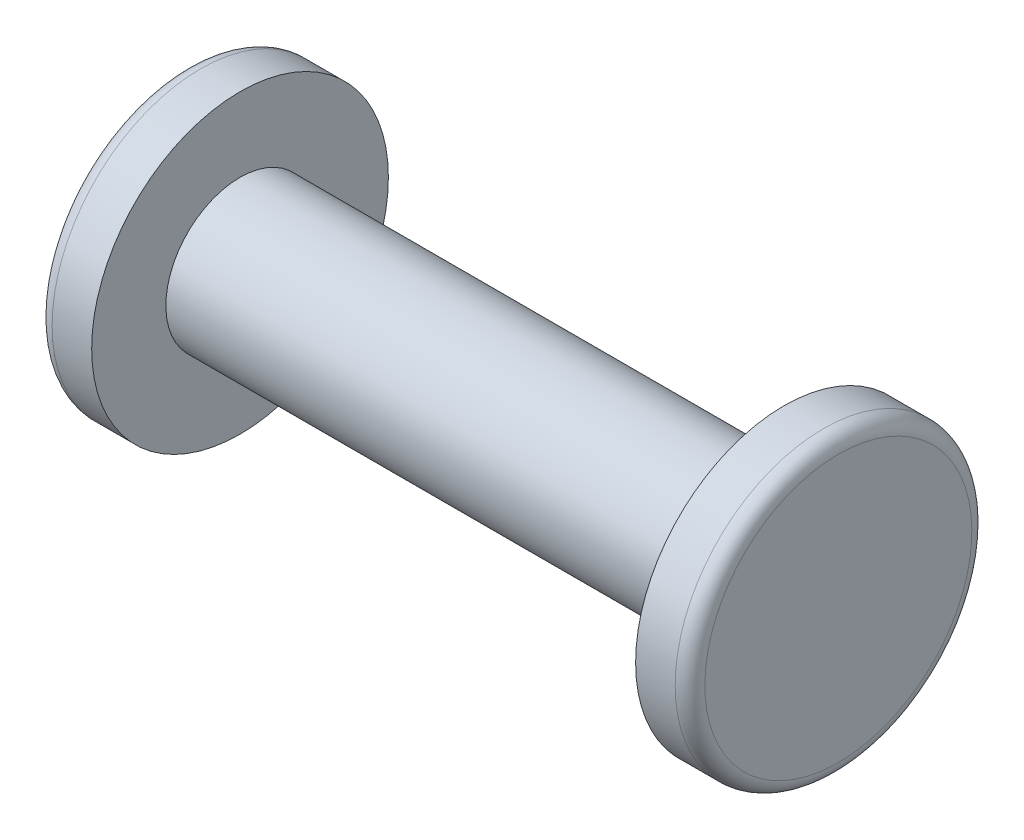
ISO-10303-21;
HEADER;
FILE_DESCRIPTION(('STEP AP214'),'2;1');
FILE_NAME('part.step','',(''),(''),'','','');
FILE_SCHEMA(('AUTOMOTIVE_DESIGN { 1 0 10303 214 1 1 1 1 }'));
ENDSEC;
DATA;
#1=APPLICATION_CONTEXT('core data for automotive mechanical design processes');
#2=APPLICATION_PROTOCOL_DEFINITION('international standard','automotive_design',2000,#1);
#3=PRODUCT_CONTEXT('',#1,'mechanical');
#4=PRODUCT('Part','Part','',(#3));
#5=PRODUCT_RELATED_PRODUCT_CATEGORY('part','',(#4));
#6=PRODUCT_DEFINITION_FORMATION('','',#4);
#7=PRODUCT_DEFINITION_CONTEXT('part definition',#1,'design');
#8=PRODUCT_DEFINITION('design','',#6,#7);
#9=PRODUCT_DEFINITION_SHAPE('','',#8);
#10=(LENGTH_UNIT() NAMED_UNIT(*) SI_UNIT(.MILLI.,.METRE.));
#11=(NAMED_UNIT(*) PLANE_ANGLE_UNIT() SI_UNIT($,.RADIAN.));
#12=(NAMED_UNIT(*) SI_UNIT($,.STERADIAN.) SOLID_ANGLE_UNIT());
#13=UNCERTAINTY_MEASURE_WITH_UNIT(LENGTH_MEASURE(1.E-05),#10,'distance_accuracy_value','');
#14=(GEOMETRIC_REPRESENTATION_CONTEXT(3) GLOBAL_UNCERTAINTY_ASSIGNED_CONTEXT((#13)) GLOBAL_UNIT_ASSIGNED_CONTEXT((#10,
#11,#12)) REPRESENTATION_CONTEXT('',''));
#15=CARTESIAN_POINT('',(0.,0.,0.));
#16=DIRECTION('',(0.,0.,1.));
#17=DIRECTION('',(1.,0.,0.));
#18=AXIS2_PLACEMENT_3D('',#15,#16,#17);
#19=CARTESIAN_POINT('',(0.,0.,0.));
#20=DIRECTION('',(-1.,0.,0.));
#21=DIRECTION('',(0.,-1.,0.));
#22=AXIS2_PLACEMENT_3D('',#19,#20,#21);
#23=PLANE('',#22);
#24=CARTESIAN_POINT('',(0.,0.,0.));
#25=DIRECTION('',(1.,0.,0.));
#26=DIRECTION('',(0.,1.,0.));
#27=AXIS2_PLACEMENT_3D('',#24,#25,#26);
#28=CIRCLE('',#27,2.7);
#29=CARTESIAN_POINT('',(0.,2.7,0.));
#30=VERTEX_POINT('',#29);
#31=EDGE_CURVE('E10',#30,#30,#28,.T.);
#32=ORIENTED_EDGE('',*,*,#31,.F.);
#33=EDGE_LOOP('',(#32));
#34=FACE_BOUND('',#33,.T.);
#35=ADVANCED_FACE('F40',(#34),#23,.T.);
#36=CARTESIAN_POINT('',(0.3,0.,0.));
#37=DIRECTION('',(1.,0.,0.));
#38=DIRECTION('',(0.,1.,0.));
#39=AXIS2_PLACEMENT_3D('',#36,#37,#38);
#40=TOROIDAL_SURFACE('',#39,2.7,0.3);
#41=ORIENTED_EDGE('',*,*,#31,.T.);
#42=EDGE_LOOP('',(#41));
#43=FACE_BOUND('',#42,.T.);
#44=CARTESIAN_POINT('',(0.300000000000002,0.,0.));
#45=DIRECTION('',(1.,0.,0.));
#46=DIRECTION('',(0.,1.,0.));
#47=AXIS2_PLACEMENT_3D('',#44,#45,#46);
#48=CIRCLE('',#47,3.);
#49=CARTESIAN_POINT('',(0.300000000000002,3.,0.));
#50=VERTEX_POINT('',#49);
#51=EDGE_CURVE('E46',#50,#50,#48,.T.);
#52=ORIENTED_EDGE('',*,*,#51,.F.);
#53=EDGE_LOOP('',(#52));
#54=FACE_BOUND('',#53,.T.);
#55=ADVANCED_FACE('F88',(#43,#54),#40,.T.);
#56=CARTESIAN_POINT('',(13.2,0.,0.));
#57=DIRECTION('',(1.,0.,0.));
#58=DIRECTION('',(0.,1.,0.));
#59=AXIS2_PLACEMENT_3D('',#56,#57,#58);
#60=CYLINDRICAL_SURFACE('',#59,3.);
#61=ORIENTED_EDGE('',*,*,#51,.T.);
#62=EDGE_LOOP('',(#61));
#63=FACE_BOUND('',#62,.T.);
#64=CARTESIAN_POINT('',(1.1,0.,0.));
#65=DIRECTION('',(1.,0.,0.));
#66=DIRECTION('',(0.,1.,0.));
#67=AXIS2_PLACEMENT_3D('',#64,#65,#66);
#68=CIRCLE('',#67,3.);
#69=CARTESIAN_POINT('',(1.1,3.,0.));
#70=VERTEX_POINT('',#69);
#71=EDGE_CURVE('E50',#70,#70,#68,.T.);
#72=ORIENTED_EDGE('',*,*,#71,.F.);
#73=EDGE_LOOP('',(#72));
#74=FACE_BOUND('',#73,.T.);
#75=ADVANCED_FACE('F93',(#63,#74),#60,.T.);
#76=CARTESIAN_POINT('',(1.1,3.,0.));
#77=DIRECTION('',(1.,0.,0.));
#78=DIRECTION('',(0.,1.,0.));
#79=AXIS2_PLACEMENT_3D('',#76,#77,#78);
#80=PLANE('',#79);
#81=ORIENTED_EDGE('',*,*,#71,.T.);
#82=EDGE_LOOP('',(#81));
#83=FACE_BOUND('',#82,.T.);
#84=CARTESIAN_POINT('',(1.1,0.,0.));
#85=DIRECTION('',(1.,0.,0.));
#86=DIRECTION('',(0.,1.,0.));
#87=AXIS2_PLACEMENT_3D('',#84,#85,#86);
#88=CIRCLE('',#87,1.5);
#89=CARTESIAN_POINT('',(1.1,1.5,0.));
#90=VERTEX_POINT('',#89);
#91=EDGE_CURVE('E54',#90,#90,#88,.T.);
#92=ORIENTED_EDGE('',*,*,#91,.F.);
#93=EDGE_LOOP('',(#92));
#94=FACE_BOUND('',#93,.T.);
#95=ADVANCED_FACE('F97',(#83,#94),#80,.T.);
#96=CARTESIAN_POINT('',(13.2,0.,0.));
#97=DIRECTION('',(1.,0.,0.));
#98=DIRECTION('',(0.,1.,0.));
#99=AXIS2_PLACEMENT_3D('',#96,#97,#98);
#100=CYLINDRICAL_SURFACE('',#99,1.5);
#101=ORIENTED_EDGE('',*,*,#91,.T.);
#102=EDGE_LOOP('',(#101));
#103=FACE_BOUND('',#102,.T.);
#104=CARTESIAN_POINT('',(12.1,0.,0.));
#105=DIRECTION('',(1.,0.,0.));
#106=DIRECTION('',(0.,1.,0.));
#107=AXIS2_PLACEMENT_3D('',#104,#105,#106);
#108=CIRCLE('',#107,1.5);
#109=CARTESIAN_POINT('',(12.1,1.5,0.));
#110=VERTEX_POINT('',#109);
#111=EDGE_CURVE('E59',#110,#110,#108,.T.);
#112=ORIENTED_EDGE('',*,*,#111,.F.);
#113=EDGE_LOOP('',(#112));
#114=FACE_BOUND('',#113,.T.);
#115=ADVANCED_FACE('F103',(#103,#114),#100,.T.);
#116=CARTESIAN_POINT('',(12.1,1.5,0.));
#117=DIRECTION('',(-1.,0.,0.));
#118=DIRECTION('',(0.,-1.,0.));
#119=AXIS2_PLACEMENT_3D('',#116,#117,#118);
#120=PLANE('',#119);
#121=ORIENTED_EDGE('',*,*,#111,.T.);
#122=EDGE_LOOP('',(#121));
#123=FACE_BOUND('',#122,.T.);
#124=CARTESIAN_POINT('',(12.1,0.,0.));
#125=DIRECTION('',(1.,0.,0.));
#126=DIRECTION('',(0.,1.,0.));
#127=AXIS2_PLACEMENT_3D('',#124,#125,#126);
#128=CIRCLE('',#127,3.);
#129=CARTESIAN_POINT('',(12.1,3.,0.));
#130=VERTEX_POINT('',#129);
#131=EDGE_CURVE('E62',#130,#130,#128,.T.);
#132=ORIENTED_EDGE('',*,*,#131,.F.);
#133=EDGE_LOOP('',(#132));
#134=FACE_BOUND('',#133,.T.);
#135=ADVANCED_FACE('F84',(#123,#134),#120,.T.);
#136=CARTESIAN_POINT('',(13.2,0.,0.));
#137=DIRECTION('',(1.,0.,0.));
#138=DIRECTION('',(0.,1.,0.));
#139=AXIS2_PLACEMENT_3D('',#136,#137,#138);
#140=CYLINDRICAL_SURFACE('',#139,3.);
#141=ORIENTED_EDGE('',*,*,#131,.T.);
#142=EDGE_LOOP('',(#141));
#143=FACE_BOUND('',#142,.T.);
#144=CARTESIAN_POINT('',(12.9,0.,0.));
#145=DIRECTION('',(1.,0.,0.));
#146=DIRECTION('',(0.,1.,0.));
#147=AXIS2_PLACEMENT_3D('',#144,#145,#146);
#148=CIRCLE('',#147,3.);
#149=CARTESIAN_POINT('',(12.9,3.,0.));
#150=VERTEX_POINT('',#149);
#151=EDGE_CURVE('E65',#150,#150,#148,.T.);
#152=ORIENTED_EDGE('',*,*,#151,.F.);
#153=EDGE_LOOP('',(#152));
#154=FACE_BOUND('',#153,.T.);
#155=ADVANCED_FACE('F76',(#143,#154),#140,.T.);
#156=CARTESIAN_POINT('',(12.9,0.,0.));
#157=DIRECTION('',(1.,0.,0.));
#158=DIRECTION('',(0.,1.,0.));
#159=AXIS2_PLACEMENT_3D('',#156,#157,#158);
#160=TOROIDAL_SURFACE('',#159,2.7,0.3);
#161=ORIENTED_EDGE('',*,*,#151,.T.);
#162=EDGE_LOOP('',(#161));
#163=FACE_BOUND('',#162,.T.);
#164=CARTESIAN_POINT('',(13.2,0.,0.));
#165=DIRECTION('',(1.,0.,0.));
#166=DIRECTION('',(0.,1.,0.));
#167=AXIS2_PLACEMENT_3D('',#164,#165,#166);
#168=CIRCLE('',#167,2.7);
#169=CARTESIAN_POINT('',(13.2,2.7,0.));
#170=VERTEX_POINT('',#169);
#171=EDGE_CURVE('E68',#170,#170,#168,.T.);
#172=ORIENTED_EDGE('',*,*,#171,.F.);
#173=EDGE_LOOP('',(#172));
#174=FACE_BOUND('',#173,.T.);
#175=ADVANCED_FACE('F74',(#163,#174),#160,.T.);
#176=CARTESIAN_POINT('',(13.2,2.7,0.));
#177=DIRECTION('',(1.,0.,0.));
#178=DIRECTION('',(0.,1.,0.));
#179=AXIS2_PLACEMENT_3D('',#176,#177,#178);
#180=PLANE('',#179);
#181=ORIENTED_EDGE('',*,*,#171,.T.);
#182=EDGE_LOOP('',(#181));
#183=FACE_BOUND('',#182,.T.);
#184=ADVANCED_FACE('F72',(#183),#180,.T.);
#185=CLOSED_SHELL('',(#35,#55,#75,#95,#115,#135,#155,#175,#184));
#186=MANIFOLD_SOLID_BREP('B2',#185);
#187=ADVANCED_BREP_SHAPE_REPRESENTATION('',(#18,#186),#14);
#188=SHAPE_DEFINITION_REPRESENTATION(#9,#187);
ENDSEC;
END-ISO-10303-21;
